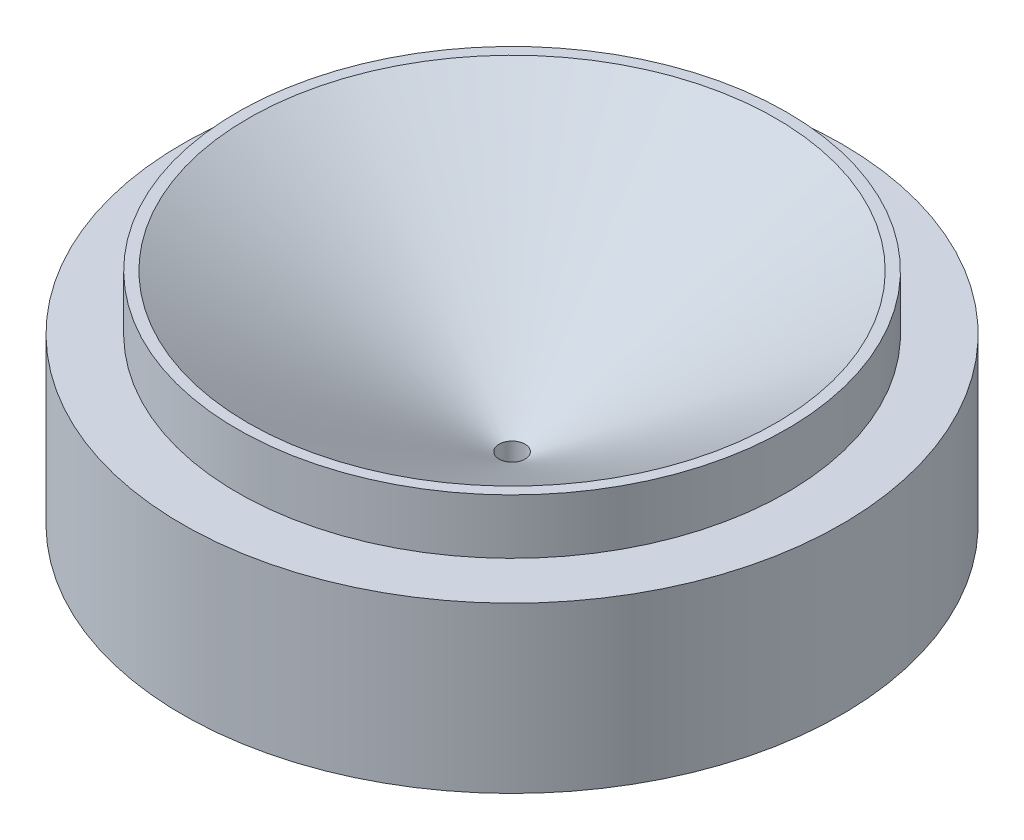
ISO-10303-21;
HEADER;
FILE_DESCRIPTION(('STEP AP214'),'2;1');
FILE_NAME('part.step','',(''),(''),'','','');
FILE_SCHEMA(('AUTOMOTIVE_DESIGN { 1 0 10303 214 1 1 1 1 }'));
ENDSEC;
DATA;
#1=APPLICATION_CONTEXT('core data for automotive mechanical design processes');
#2=APPLICATION_PROTOCOL_DEFINITION('international standard','automotive_design',2000,#1);
#3=PRODUCT_CONTEXT('',#1,'mechanical');
#4=PRODUCT('Part','Part','',(#3));
#5=PRODUCT_RELATED_PRODUCT_CATEGORY('part','',(#4));
#6=PRODUCT_DEFINITION_FORMATION('','',#4);
#7=PRODUCT_DEFINITION_CONTEXT('part definition',#1,'design');
#8=PRODUCT_DEFINITION('design','',#6,#7);
#9=PRODUCT_DEFINITION_SHAPE('','',#8);
#10=(LENGTH_UNIT() NAMED_UNIT(*) SI_UNIT(.MILLI.,.METRE.));
#11=(NAMED_UNIT(*) PLANE_ANGLE_UNIT() SI_UNIT($,.RADIAN.));
#12=(NAMED_UNIT(*) SI_UNIT($,.STERADIAN.) SOLID_ANGLE_UNIT());
#13=UNCERTAINTY_MEASURE_WITH_UNIT(LENGTH_MEASURE(1.E-05),#10,'distance_accuracy_value','');
#14=(GEOMETRIC_REPRESENTATION_CONTEXT(3) GLOBAL_UNCERTAINTY_ASSIGNED_CONTEXT((#13)) GLOBAL_UNIT_ASSIGNED_CONTEXT((#10,
#11,#12)) REPRESENTATION_CONTEXT('',''));
#15=CARTESIAN_POINT('',(0.,0.,0.));
#16=DIRECTION('',(0.,0.,1.));
#17=DIRECTION('',(1.,0.,0.));
#18=AXIS2_PLACEMENT_3D('',#15,#16,#17);
#19=CARTESIAN_POINT('',(0.,-19.05,0.));
#20=DIRECTION('',(0.,-1.,0.));
#21=DIRECTION('',(0.,0.,-1.));
#22=AXIS2_PLACEMENT_3D('',#19,#20,#21);
#23=CYLINDRICAL_SURFACE('',#22,38.1);
#24=CARTESIAN_POINT('',(0.,0.,0.));
#25=DIRECTION('',(0.,-1.,0.));
#26=DIRECTION('',(0.,0.,-1.));
#27=AXIS2_PLACEMENT_3D('',#24,#25,#26);
#28=CIRCLE('',#27,38.1);
#29=CARTESIAN_POINT('',(0.,0.,-38.1));
#30=VERTEX_POINT('',#29);
#31=EDGE_CURVE('E50',#30,#30,#28,.T.);
#32=ORIENTED_EDGE('',*,*,#31,.T.);
#33=EDGE_LOOP('',(#32));
#34=FACE_BOUND('',#33,.T.);
#35=CARTESIAN_POINT('',(0.,-19.05,0.));
#36=DIRECTION('',(0.,-1.,0.));
#37=DIRECTION('',(0.,0.,-1.));
#38=AXIS2_PLACEMENT_3D('',#35,#36,#37);
#39=CIRCLE('',#38,38.1);
#40=CARTESIAN_POINT('',(0.,-19.05,-38.1));
#41=VERTEX_POINT('',#40);
#42=EDGE_CURVE('E10',#41,#41,#39,.T.);
#43=ORIENTED_EDGE('',*,*,#42,.F.);
#44=EDGE_LOOP('',(#43));
#45=FACE_BOUND('',#44,.T.);
#46=ADVANCED_FACE('F31',(#34,#45),#23,.T.);
#47=CARTESIAN_POINT('',(38.1,-19.05,0.));
#48=DIRECTION('',(0.,-1.,0.));
#49=DIRECTION('',(0.,0.,-1.));
#50=AXIS2_PLACEMENT_3D('',#47,#48,#49);
#51=PLANE('',#50);
#52=CARTESIAN_POINT('',(0.,-19.05,0.));
#53=DIRECTION('',(0.,-1.,0.));
#54=DIRECTION('',(0.,0.,-1.));
#55=AXIS2_PLACEMENT_3D('',#52,#53,#54);
#56=CIRCLE('',#55,1.5);
#57=CARTESIAN_POINT('',(0.,-19.05,-1.5));
#58=VERTEX_POINT('',#57);
#59=EDGE_CURVE('E53',#58,#58,#56,.T.);
#60=ORIENTED_EDGE('',*,*,#59,.F.);
#61=EDGE_LOOP('',(#60));
#62=FACE_BOUND('',#61,.T.);
#63=ORIENTED_EDGE('',*,*,#42,.T.);
#64=EDGE_LOOP('',(#63));
#65=FACE_BOUND('',#64,.T.);
#66=ADVANCED_FACE('F66',(#62,#65),#51,.T.);
#67=CARTESIAN_POINT('',(0.,6.35,0.));
#68=DIRECTION('',(0.,1.,0.));
#69=DIRECTION('',(0.,0.,1.));
#70=AXIS2_PLACEMENT_3D('',#67,#68,#69);
#71=CONICAL_SURFACE('',#70,30.5054,1.01257131896492);
#72=CARTESIAN_POINT('',(0.,-11.7632805995004,0.));
#73=DIRECTION('',(0.,1.,0.));
#74=DIRECTION('',(0.,0.,1.));
#75=AXIS2_PLACEMENT_3D('',#72,#73,#74);
#76=CIRCLE('',#75,1.5);
#77=CARTESIAN_POINT('',(0.,-11.7632805995004,1.5));
#78=VERTEX_POINT('',#77);
#79=EDGE_CURVE('E34',#78,#78,#76,.T.);
#80=CARTESIAN_POINT('',(0.,6.35,0.));
#81=DIRECTION('',(0.,-1.,0.));
#82=DIRECTION('',(0.,0.,-1.));
#83=AXIS2_PLACEMENT_3D('',#80,#81,#82);
#84=CIRCLE('',#83,30.5054);
#85=CARTESIAN_POINT('',(0.,6.35,30.5054));
#86=VERTEX_POINT('',#85);
#87=EDGE_CURVE('E38',#86,#86,#84,.T.);
#88=CARTESIAN_POINT('',(0.,-11.7632805995004,1.5));
#89=CARTESIAN_POINT('',(0.,-11.5746005932556,1.80213958333334));
#90=CARTESIAN_POINT('',(0.,-11.3859205870108,2.10427916666667));
#91=CARTESIAN_POINT('',(0.,-11.0085605745212,2.70855833333334));
#92=CARTESIAN_POINT('',(0.,-10.8198805682764,3.01069791666667));
#93=CARTESIAN_POINT('',(0.,-10.4425205557868,3.61497708333333));
#94=CARTESIAN_POINT('',(0.,-10.253840549542,3.91711666666667));
#95=CARTESIAN_POINT('',(0.,-9.87648053705246,4.52139583333333));
#96=CARTESIAN_POINT('',(0.,-9.68780053080766,4.82353541666667));
#97=CARTESIAN_POINT('',(0.,-9.31044051831807,5.42781458333333));
#98=CARTESIAN_POINT('',(0.,-9.12176051207327,5.72995416666667));
#99=CARTESIAN_POINT('',(0.,-8.74440049958368,6.33423333333334));
#100=CARTESIAN_POINT('',(0.,-8.55572049333888,6.63637291666667));
#101=CARTESIAN_POINT('',(0.,-8.17836048084929,7.24065208333334));
#102=CARTESIAN_POINT('',(0.,-7.9896804746045,7.54279166666667));
#103=CARTESIAN_POINT('',(0.,-7.6123204621149,8.14707083333334));
#104=CARTESIAN_POINT('',(0.,-7.42364045587011,8.44921041666667));
#105=CARTESIAN_POINT('',(0.,-7.04628044338052,9.05348958333333));
#106=CARTESIAN_POINT('',(0.,-6.85760043713572,9.35562916666667));
#107=CARTESIAN_POINT('',(0.,-6.48024042464613,9.95990833333333));
#108=CARTESIAN_POINT('',(0.,-6.29156041840133,10.2620479166667));
#109=CARTESIAN_POINT('',(0.,-5.91420040591174,10.8663270833333));
#110=CARTESIAN_POINT('',(0.,-5.72552039966694,11.1684666666667));
#111=CARTESIAN_POINT('',(0.,-5.34816038717735,11.7727458333333));
#112=CARTESIAN_POINT('',(0.,-5.15948038093256,12.0748854166667));
#113=CARTESIAN_POINT('',(0.,-4.78212036844296,12.6791645833333));
#114=CARTESIAN_POINT('',(0.,-4.59344036219817,12.9813041666667));
#115=CARTESIAN_POINT('',(0.,-4.21608034970857,13.5855833333333));
#116=CARTESIAN_POINT('',(0.,-4.02740034346378,13.8877229166667));
#117=CARTESIAN_POINT('',(0.,-3.65004033097419,14.4920020833333));
#118=CARTESIAN_POINT('',(0.,-3.46136032472939,14.7941416666667));
#119=CARTESIAN_POINT('',(0.,-3.0840003122398,15.3984208333333));
#120=CARTESIAN_POINT('',(0.,-2.895320305995,15.7005604166667));
#121=CARTESIAN_POINT('',(0.,-2.51796029350541,16.3048395833333));
#122=CARTESIAN_POINT('',(0.,-2.32928028726062,16.6069791666667));
#123=CARTESIAN_POINT('',(0.,-1.95192027477102,17.2112583333333));
#124=CARTESIAN_POINT('',(0.,-1.76324026852623,17.5133979166667));
#125=CARTESIAN_POINT('',(0.,-1.38588025603664,18.1176770833333));
#126=CARTESIAN_POINT('',(0.,-1.19720024979184,18.4198166666667));
#127=CARTESIAN_POINT('',(0.,-0.819840237302247,19.0240958333333));
#128=CARTESIAN_POINT('',(0.,-0.631160231057451,19.3262354166667));
#129=CARTESIAN_POINT('',(0.,-0.253800218567859,19.9305145833333));
#130=CARTESIAN_POINT('',(0.,-0.0651202123230635,20.2326541666667));
#131=CARTESIAN_POINT('',(0.,0.312239800166529,20.8369333333333));
#132=CARTESIAN_POINT('',(0.,0.500919806411326,21.1390729166667));
#133=CARTESIAN_POINT('',(0.,0.878279818900918,21.7433520833333));
#134=CARTESIAN_POINT('',(0.,1.06695982514571,22.0454916666667));
#135=CARTESIAN_POINT('',(0.,1.44431983763531,22.6497708333333));
#136=CARTESIAN_POINT('',(0.,1.6329998438801,22.9519104166667));
#137=CARTESIAN_POINT('',(0.,2.01035985636969,23.5561895833333));
#138=CARTESIAN_POINT('',(0.,2.19903986261449,23.8583291666667));
#139=CARTESIAN_POINT('',(0.,2.57639987510408,24.4626083333333));
#140=CARTESIAN_POINT('',(0.,2.76507988134888,24.7647479166667));
#141=CARTESIAN_POINT('',(0.,3.14243989383847,25.3690270833333));
#142=CARTESIAN_POINT('',(0.,3.33111990008327,25.6711666666667));
#143=CARTESIAN_POINT('',(0.,3.70847991257286,26.2754458333333));
#144=CARTESIAN_POINT('',(0.,3.89715991881766,26.5775854166667));
#145=CARTESIAN_POINT('',(0.,4.27451993130725,27.1818645833333));
#146=CARTESIAN_POINT('',(0.,4.46319993755204,27.4840041666667));
#147=CARTESIAN_POINT('',(0.,4.84055995004163,28.0882833333333));
#148=CARTESIAN_POINT('',(0.,5.02923995628643,28.3904229166667));
#149=CARTESIAN_POINT('',(0.,5.40659996877602,28.9947020833333));
#150=CARTESIAN_POINT('',(0.,5.59527997502082,29.2968416666667));
#151=CARTESIAN_POINT('',(0.,5.97263998751041,29.9011208333333));
#152=CARTESIAN_POINT('',(0.,6.16131999375521,30.2032604166667));
#153=CARTESIAN_POINT('',(0.,6.35,30.5054));
#154=B_SPLINE_CURVE_WITH_KNOTS('',3,(#88,#89,#90,#91,#92,#93,#94,#95,#96,#97,#98,#99,#100,#101,
#102,#103,#104,#105,#106,#107,#108,#109,#110,#111,#112,#113,#114,#115,#116,#117,#118,#119,#120,
#121,#122,#123,#124,#125,#126,#127,#128,#129,#130,#131,#132,#133,#134,#135,#136,#137,#138,#139,
#140,#141,#142,#143,#144,#145,#146,#147,#148,#149,#150,#151,#152,#153),.UNSPECIFIED.,.F.,.F.,(4,
2,2,2,2,2,2,2,2,2,2,2,2,2,2,2,2,2,2,2,2,2,2,2,2,2,2,2,2,2,2,2,4),(0.,1.06864224750868,
2.13728449501734,3.20592674252602,4.27456899003469,5.34321123754337,6.41185348505204,
7.48049573256072,8.54913798006939,9.61778022757806,10.6864224750867,11.7550647225954,
12.8237069701041,13.8923492176128,14.9609914651214,16.0296337126301,17.0982759601388,
18.1669182076474,19.2355604551561,20.3042027026648,21.3728449501735,22.4414871976821,
23.5101294451908,24.5787716926995,25.6474139402082,26.7160561877168,27.7846984352255,
28.8533406827342,29.9219829302428,30.9906251777515,32.0592674252602,33.1279096727689,
34.1965519202775),.UNSPECIFIED.);
#155=EDGE_CURVE('BSEAM62',#78,#86,#154,.T.);
#156=ORIENTED_EDGE('',*,*,#79,.F.);
#157=ORIENTED_EDGE('',*,*,#87,.F.);
#158=ORIENTED_EDGE('',*,*,#155,.T.);
#159=ORIENTED_EDGE('',*,*,#155,.F.);
#160=EDGE_LOOP('',(#156,#158,#157,#159));
#161=FACE_BOUND('',#160,.T.);
#162=ADVANCED_FACE('F62',(#161),#71,.F.);
#163=CARTESIAN_POINT('',(31.75,6.35,0.));
#164=DIRECTION('',(0.,1.,0.));
#165=DIRECTION('',(0.,0.,1.));
#166=AXIS2_PLACEMENT_3D('',#163,#164,#165);
#167=PLANE('',#166);
#168=ORIENTED_EDGE('',*,*,#87,.T.);
#169=EDGE_LOOP('',(#168));
#170=FACE_BOUND('',#169,.T.);
#171=CARTESIAN_POINT('',(0.,6.35,0.));
#172=DIRECTION('',(0.,-1.,0.));
#173=DIRECTION('',(0.,0.,-1.));
#174=AXIS2_PLACEMENT_3D('',#171,#172,#173);
#175=CIRCLE('',#174,31.75);
#176=CARTESIAN_POINT('',(0.,6.35,-31.75));
#177=VERTEX_POINT('',#176);
#178=EDGE_CURVE('E42',#177,#177,#175,.T.);
#179=ORIENTED_EDGE('',*,*,#178,.F.);
#180=EDGE_LOOP('',(#179));
#181=FACE_BOUND('',#180,.T.);
#182=ADVANCED_FACE('F65',(#170,#181),#167,.T.);
#183=CARTESIAN_POINT('',(0.,-19.05,0.));
#184=DIRECTION('',(0.,-1.,0.));
#185=DIRECTION('',(0.,0.,-1.));
#186=AXIS2_PLACEMENT_3D('',#183,#184,#185);
#187=CYLINDRICAL_SURFACE('',#186,31.75);
#188=ORIENTED_EDGE('',*,*,#178,.T.);
#189=EDGE_LOOP('',(#188));
#190=FACE_BOUND('',#189,.T.);
#191=CARTESIAN_POINT('',(0.,0.,0.));
#192=DIRECTION('',(0.,-1.,0.));
#193=DIRECTION('',(0.,0.,-1.));
#194=AXIS2_PLACEMENT_3D('',#191,#192,#193);
#195=CIRCLE('',#194,31.75);
#196=CARTESIAN_POINT('',(0.,0.,-31.75));
#197=VERTEX_POINT('',#196);
#198=EDGE_CURVE('E47',#197,#197,#195,.T.);
#199=ORIENTED_EDGE('',*,*,#198,.F.);
#200=EDGE_LOOP('',(#199));
#201=FACE_BOUND('',#200,.T.);
#202=ADVANCED_FACE('F72',(#190,#201),#187,.T.);
#203=CARTESIAN_POINT('',(31.75,0.,0.));
#204=DIRECTION('',(0.,1.,0.));
#205=DIRECTION('',(0.,0.,1.));
#206=AXIS2_PLACEMENT_3D('',#203,#204,#205);
#207=PLANE('',#206);
#208=ORIENTED_EDGE('',*,*,#198,.T.);
#209=EDGE_LOOP('',(#208));
#210=FACE_BOUND('',#209,.T.);
#211=ORIENTED_EDGE('',*,*,#31,.F.);
#212=EDGE_LOOP('',(#211));
#213=FACE_BOUND('',#212,.T.);
#214=ADVANCED_FACE('F78',(#210,#213),#207,.T.);
#215=CARTESIAN_POINT('',(0.,6.35,0.));
#216=DIRECTION('',(0.,-1.,0.));
#217=DIRECTION('',(0.,0.,-1.));
#218=AXIS2_PLACEMENT_3D('',#215,#216,#217);
#219=CYLINDRICAL_SURFACE('',#218,1.5);
#220=ORIENTED_EDGE('',*,*,#79,.T.);
#221=EDGE_LOOP('',(#220));
#222=FACE_BOUND('',#221,.T.);
#223=ORIENTED_EDGE('',*,*,#59,.T.);
#224=EDGE_LOOP('',(#223));
#225=FACE_BOUND('',#224,.T.);
#226=ADVANCED_FACE('F60',(#222,#225),#219,.F.);
#227=CLOSED_SHELL('',(#46,#66,#162,#182,#202,#214,#226));
#228=MANIFOLD_SOLID_BREP('B2',#227);
#229=ADVANCED_BREP_SHAPE_REPRESENTATION('',(#18,#228),#14);
#230=SHAPE_DEFINITION_REPRESENTATION(#9,#229);
ENDSEC;
END-ISO-10303-21;
